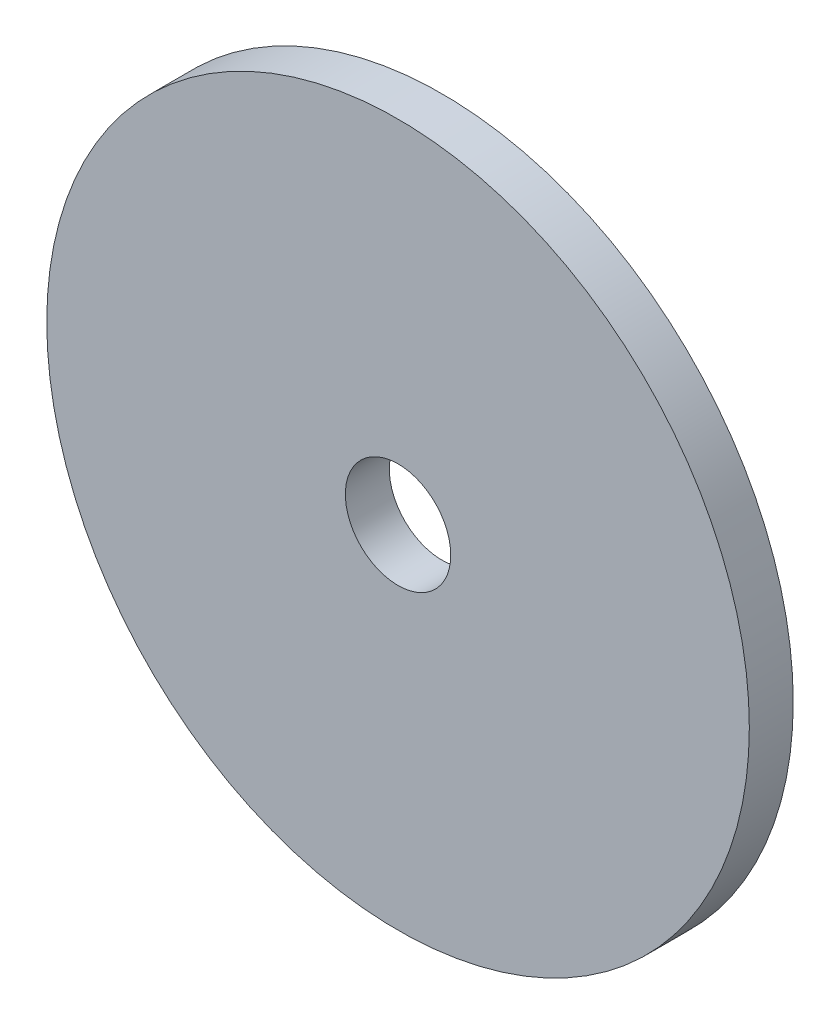
ISO-10303-21;
HEADER;
FILE_DESCRIPTION(('STEP AP214'),'2;1');
FILE_NAME('part.step','',(''),(''),'','','');
FILE_SCHEMA(('AUTOMOTIVE_DESIGN { 1 0 10303 214 1 1 1 1 }'));
ENDSEC;
DATA;
#1=APPLICATION_CONTEXT('core data for automotive mechanical design processes');
#2=APPLICATION_PROTOCOL_DEFINITION('international standard','automotive_design',2000,#1);
#3=PRODUCT_CONTEXT('',#1,'mechanical');
#4=PRODUCT('Part','Part','',(#3));
#5=PRODUCT_RELATED_PRODUCT_CATEGORY('part','',(#4));
#6=PRODUCT_DEFINITION_FORMATION('','',#4);
#7=PRODUCT_DEFINITION_CONTEXT('part definition',#1,'design');
#8=PRODUCT_DEFINITION('design','',#6,#7);
#9=PRODUCT_DEFINITION_SHAPE('','',#8);
#10=(LENGTH_UNIT() NAMED_UNIT(*) SI_UNIT(.MILLI.,.METRE.));
#11=(NAMED_UNIT(*) PLANE_ANGLE_UNIT() SI_UNIT($,.RADIAN.));
#12=(NAMED_UNIT(*) SI_UNIT($,.STERADIAN.) SOLID_ANGLE_UNIT());
#13=UNCERTAINTY_MEASURE_WITH_UNIT(LENGTH_MEASURE(1.E-05),#10,'distance_accuracy_value','');
#14=(GEOMETRIC_REPRESENTATION_CONTEXT(3) GLOBAL_UNCERTAINTY_ASSIGNED_CONTEXT((#13)) GLOBAL_UNIT_ASSIGNED_CONTEXT((#10,
#11,#12)) REPRESENTATION_CONTEXT('',''));
#15=CARTESIAN_POINT('',(0.,0.,0.));
#16=DIRECTION('',(0.,0.,1.));
#17=DIRECTION('',(1.,0.,0.));
#18=AXIS2_PLACEMENT_3D('',#15,#16,#17);
#19=CARTESIAN_POINT('',(0.,0.,0.));
#20=DIRECTION('',(0.,0.,1.));
#21=DIRECTION('',(1.,0.,0.));
#22=AXIS2_PLACEMENT_3D('',#19,#20,#21);
#23=PLANE('',#22);
#24=CARTESIAN_POINT('',(0.,0.,0.));
#25=DIRECTION('',(0.,0.,1.));
#26=DIRECTION('',(1.,0.,0.));
#27=AXIS2_PLACEMENT_3D('',#24,#25,#26);
#28=CIRCLE('',#27,14.5);
#29=CARTESIAN_POINT('',(14.5,0.,0.));
#30=VERTEX_POINT('',#29);
#31=EDGE_CURVE('E47',#30,#30,#28,.T.);
#32=ORIENTED_EDGE('',*,*,#31,.T.);
#33=EDGE_LOOP('',(#32));
#34=FACE_BOUND('',#33,.T.);
#35=CARTESIAN_POINT('',(0.,0.,0.));
#36=DIRECTION('',(0.,0.,1.));
#37=DIRECTION('',(1.,0.,0.));
#38=AXIS2_PLACEMENT_3D('',#35,#36,#37);
#39=CIRCLE('',#38,79.);
#40=CARTESIAN_POINT('',(79.,0.,0.));
#41=VERTEX_POINT('',#40);
#42=EDGE_CURVE('E10',#41,#41,#39,.T.);
#43=ORIENTED_EDGE('',*,*,#42,.F.);
#44=EDGE_LOOP('',(#43));
#45=FACE_BOUND('',#44,.T.);
#46=ADVANCED_FACE('F31',(#34,#45),#23,.F.);
#47=CARTESIAN_POINT('',(0.,0.,5.));
#48=DIRECTION('',(0.,0.,1.));
#49=DIRECTION('',(1.,0.,0.));
#50=AXIS2_PLACEMENT_3D('',#47,#48,#49);
#51=PLANE('',#50);
#52=CARTESIAN_POINT('',(0.,0.,5.));
#53=DIRECTION('',(0.,0.,1.));
#54=DIRECTION('',(1.,0.,0.));
#55=AXIS2_PLACEMENT_3D('',#52,#53,#54);
#56=CIRCLE('',#55,80.);
#57=CARTESIAN_POINT('',(80.,0.,5.));
#58=VERTEX_POINT('',#57);
#59=EDGE_CURVE('E38',#58,#58,#56,.T.);
#60=ORIENTED_EDGE('',*,*,#59,.T.);
#61=EDGE_LOOP('',(#60));
#62=FACE_BOUND('',#61,.T.);
#63=CARTESIAN_POINT('',(0.,0.,5.));
#64=DIRECTION('',(0.,0.,1.));
#65=DIRECTION('',(1.,0.,0.));
#66=AXIS2_PLACEMENT_3D('',#63,#64,#65);
#67=CIRCLE('',#66,12.);
#68=CARTESIAN_POINT('',(12.,0.,5.));
#69=VERTEX_POINT('',#68);
#70=EDGE_CURVE('E42',#69,#69,#67,.T.);
#71=ORIENTED_EDGE('',*,*,#70,.F.);
#72=EDGE_LOOP('',(#71));
#73=FACE_BOUND('',#72,.T.);
#74=ADVANCED_FACE('F84',(#62,#73),#51,.T.);
#75=CARTESIAN_POINT('',(0.,0.,5.));
#76=DIRECTION('',(0.,0.,-1.));
#77=DIRECTION('',(-1.,0.,0.));
#78=AXIS2_PLACEMENT_3D('',#75,#76,#77);
#79=CYLINDRICAL_SURFACE('',#78,80.);
#80=ORIENTED_EDGE('',*,*,#59,.F.);
#81=EDGE_LOOP('',(#80));
#82=FACE_BOUND('',#81,.T.);
#83=CARTESIAN_POINT('',(0.,0.,-5.));
#84=DIRECTION('',(0.,0.,1.));
#85=DIRECTION('',(1.,0.,0.));
#86=AXIS2_PLACEMENT_3D('',#83,#84,#85);
#87=CIRCLE('',#86,80.);
#88=CARTESIAN_POINT('',(80.,0.,-5.));
#89=VERTEX_POINT('',#88);
#90=EDGE_CURVE('E59',#89,#89,#87,.T.);
#91=ORIENTED_EDGE('',*,*,#90,.T.);
#92=EDGE_LOOP('',(#91));
#93=FACE_BOUND('',#92,.T.);
#94=ADVANCED_FACE('F33',(#82,#93),#79,.T.);
#95=CARTESIAN_POINT('',(0.,0.,5.));
#96=DIRECTION('',(0.,0.,-1.));
#97=DIRECTION('',(-1.,0.,0.));
#98=AXIS2_PLACEMENT_3D('',#95,#96,#97);
#99=CYLINDRICAL_SURFACE('',#98,12.);
#100=ORIENTED_EDGE('',*,*,#70,.T.);
#101=EDGE_LOOP('',(#100));
#102=FACE_BOUND('',#101,.T.);
#103=CARTESIAN_POINT('',(0.,0.,-5.));
#104=DIRECTION('',(0.,0.,1.));
#105=DIRECTION('',(1.,0.,0.));
#106=AXIS2_PLACEMENT_3D('',#103,#104,#105);
#107=CIRCLE('',#106,12.);
#108=CARTESIAN_POINT('',(12.,0.,-5.));
#109=VERTEX_POINT('',#108);
#110=EDGE_CURVE('E55',#109,#109,#107,.T.);
#111=ORIENTED_EDGE('',*,*,#110,.F.);
#112=EDGE_LOOP('',(#111));
#113=FACE_BOUND('',#112,.T.);
#114=ADVANCED_FACE('F91',(#102,#113),#99,.F.);
#115=CARTESIAN_POINT('',(0.,0.,-5.));
#116=DIRECTION('',(0.,0.,1.));
#117=DIRECTION('',(1.,0.,0.));
#118=AXIS2_PLACEMENT_3D('',#115,#116,#117);
#119=CYLINDRICAL_SURFACE('',#118,14.5);
#120=CARTESIAN_POINT('',(0.,0.,-5.));
#121=DIRECTION('',(0.,0.,1.));
#122=DIRECTION('',(1.,0.,0.));
#123=AXIS2_PLACEMENT_3D('',#120,#121,#122);
#124=CIRCLE('',#123,14.5);
#125=CARTESIAN_POINT('',(14.5,0.,-5.));
#126=VERTEX_POINT('',#125);
#127=EDGE_CURVE('E51',#126,#126,#124,.T.);
#128=ORIENTED_EDGE('',*,*,#127,.T.);
#129=EDGE_LOOP('',(#128));
#130=FACE_BOUND('',#129,.T.);
#131=ORIENTED_EDGE('',*,*,#31,.F.);
#132=EDGE_LOOP('',(#131));
#133=FACE_BOUND('',#132,.T.);
#134=ADVANCED_FACE('F80',(#130,#133),#119,.T.);
#135=CARTESIAN_POINT('',(0.,0.,-5.));
#136=DIRECTION('',(0.,0.,1.));
#137=DIRECTION('',(1.,0.,0.));
#138=AXIS2_PLACEMENT_3D('',#135,#136,#137);
#139=PLANE('',#138);
#140=ORIENTED_EDGE('',*,*,#110,.T.);
#141=EDGE_LOOP('',(#140));
#142=FACE_BOUND('',#141,.T.);
#143=ORIENTED_EDGE('',*,*,#127,.F.);
#144=EDGE_LOOP('',(#143));
#145=FACE_BOUND('',#144,.T.);
#146=ADVANCED_FACE('F73',(#142,#145),#139,.F.);
#147=CARTESIAN_POINT('',(0.,0.,-5.));
#148=DIRECTION('',(0.,0.,1.));
#149=DIRECTION('',(1.,0.,0.));
#150=AXIS2_PLACEMENT_3D('',#147,#148,#149);
#151=CYLINDRICAL_SURFACE('',#150,79.);
#152=CARTESIAN_POINT('',(0.,0.,-5.));
#153=DIRECTION('',(0.,0.,1.));
#154=DIRECTION('',(1.,0.,0.));
#155=AXIS2_PLACEMENT_3D('',#152,#153,#154);
#156=CIRCLE('',#155,79.);
#157=CARTESIAN_POINT('',(79.,0.,-5.));
#158=VERTEX_POINT('',#157);
#159=EDGE_CURVE('E64',#158,#158,#156,.T.);
#160=ORIENTED_EDGE('',*,*,#159,.F.);
#161=EDGE_LOOP('',(#160));
#162=FACE_BOUND('',#161,.T.);
#163=ORIENTED_EDGE('',*,*,#42,.T.);
#164=EDGE_LOOP('',(#163));
#165=FACE_BOUND('',#164,.T.);
#166=ADVANCED_FACE('F71',(#162,#165),#151,.F.);
#167=CARTESIAN_POINT('',(0.,0.,-5.));
#168=DIRECTION('',(0.,0.,1.));
#169=DIRECTION('',(1.,0.,0.));
#170=AXIS2_PLACEMENT_3D('',#167,#168,#169);
#171=PLANE('',#170);
#172=ORIENTED_EDGE('',*,*,#159,.T.);
#173=EDGE_LOOP('',(#172));
#174=FACE_BOUND('',#173,.T.);
#175=ORIENTED_EDGE('',*,*,#90,.F.);
#176=EDGE_LOOP('',(#175));
#177=FACE_BOUND('',#176,.T.);
#178=ADVANCED_FACE('F68',(#174,#177),#171,.F.);
#179=CLOSED_SHELL('',(#46,#74,#94,#114,#134,#146,#166,#178));
#180=MANIFOLD_SOLID_BREP('B2',#179);
#181=ADVANCED_BREP_SHAPE_REPRESENTATION('',(#18,#180),#14);
#182=SHAPE_DEFINITION_REPRESENTATION(#9,#181);
ENDSEC;
END-ISO-10303-21;
